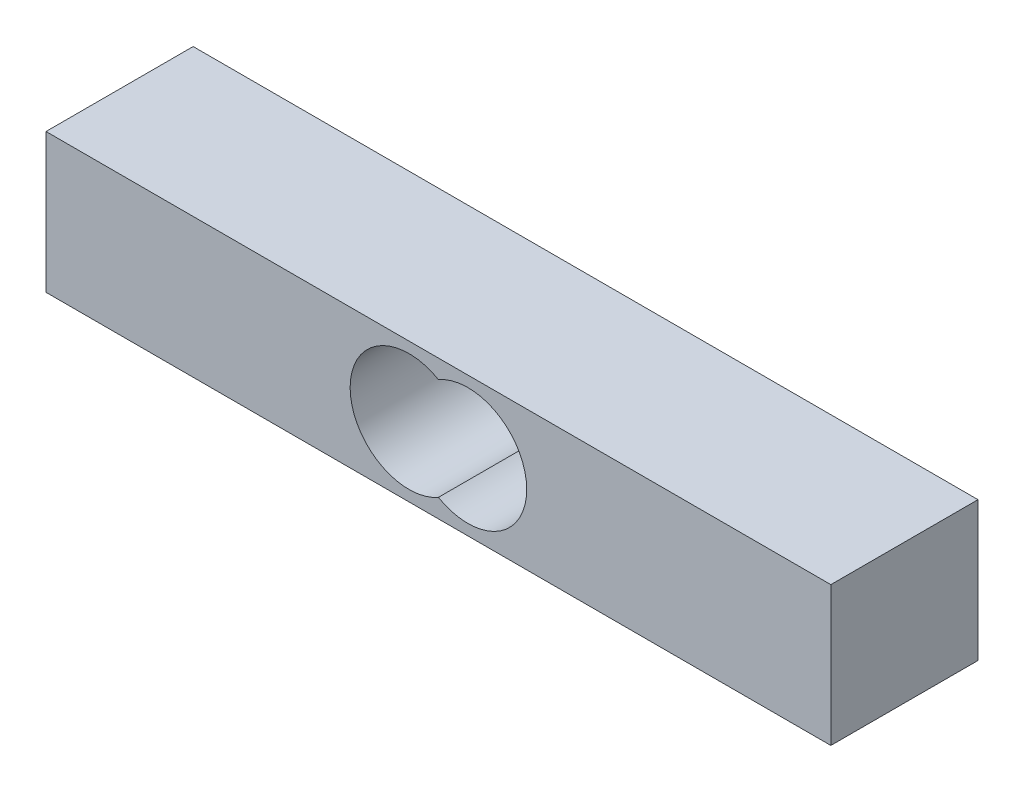
ISO-10303-21;
HEADER;
FILE_DESCRIPTION(('STEP AP214'),'2;1');
FILE_NAME('part.step','',(''),(''),'','','');
FILE_SCHEMA(('AUTOMOTIVE_DESIGN { 1 0 10303 214 1 1 1 1 }'));
ENDSEC;
DATA;
#1=APPLICATION_CONTEXT('core data for automotive mechanical design processes');
#2=APPLICATION_PROTOCOL_DEFINITION('international standard','automotive_design',2000,#1);
#3=PRODUCT_CONTEXT('',#1,'mechanical');
#4=PRODUCT('Part','Part','',(#3));
#5=PRODUCT_RELATED_PRODUCT_CATEGORY('part','',(#4));
#6=PRODUCT_DEFINITION_FORMATION('','',#4);
#7=PRODUCT_DEFINITION_CONTEXT('part definition',#1,'design');
#8=PRODUCT_DEFINITION('design','',#6,#7);
#9=PRODUCT_DEFINITION_SHAPE('','',#8);
#10=(LENGTH_UNIT() NAMED_UNIT(*) SI_UNIT(.MILLI.,.METRE.));
#11=(NAMED_UNIT(*) PLANE_ANGLE_UNIT() SI_UNIT($,.RADIAN.));
#12=(NAMED_UNIT(*) SI_UNIT($,.STERADIAN.) SOLID_ANGLE_UNIT());
#13=UNCERTAINTY_MEASURE_WITH_UNIT(LENGTH_MEASURE(1.E-05),#10,'distance_accuracy_value','');
#14=(GEOMETRIC_REPRESENTATION_CONTEXT(3) GLOBAL_UNCERTAINTY_ASSIGNED_CONTEXT((#13)) GLOBAL_UNIT_ASSIGNED_CONTEXT((#10,
#11,#12)) REPRESENTATION_CONTEXT('',''));
#15=CARTESIAN_POINT('',(0.,0.,0.));
#16=DIRECTION('',(0.,0.,1.));
#17=DIRECTION('',(1.,0.,0.));
#18=AXIS2_PLACEMENT_3D('',#15,#16,#17);
#19=CARTESIAN_POINT('',(40.,14.2,7.5));
#20=DIRECTION('',(-1.,0.,0.));
#21=DIRECTION('',(0.,0.,1.));
#22=AXIS2_PLACEMENT_3D('',#19,#20,#21);
#23=PLANE('',#22);
#24=DIRECTION('',(0.,0.,-1.));
#25=VECTOR('',#24,1.);
#26=CARTESIAN_POINT('',(40.,0.,7.5));
#27=LINE('',#26,#25);
#28=CARTESIAN_POINT('',(40.,0.,7.5));
#29=VERTEX_POINT('',#28);
#30=CARTESIAN_POINT('',(40.,0.,-7.5));
#31=VERTEX_POINT('',#30);
#32=EDGE_CURVE('E120',#29,#31,#27,.T.);
#33=ORIENTED_EDGE('',*,*,#32,.T.);
#34=DIRECTION('',(0.,-1.,0.));
#35=VECTOR('',#34,1.);
#36=CARTESIAN_POINT('',(40.,14.2,-7.5));
#37=LINE('',#36,#35);
#38=CARTESIAN_POINT('',(40.,14.2,-7.5));
#39=VERTEX_POINT('',#38);
#40=EDGE_CURVE('E11',#39,#31,#37,.T.);
#41=ORIENTED_EDGE('',*,*,#40,.F.);
#42=DIRECTION('',(0.,0.,-1.));
#43=VECTOR('',#42,1.);
#44=CARTESIAN_POINT('',(40.,14.2,7.5));
#45=LINE('',#44,#43);
#46=CARTESIAN_POINT('',(40.,14.2,7.5));
#47=VERTEX_POINT('',#46);
#48=EDGE_CURVE('E122',#47,#39,#45,.T.);
#49=ORIENTED_EDGE('',*,*,#48,.F.);
#50=DIRECTION('',(0.,-1.,0.));
#51=VECTOR('',#50,1.);
#52=CARTESIAN_POINT('',(40.,14.2,7.5));
#53=LINE('',#52,#51);
#54=EDGE_CURVE('E136',#47,#29,#53,.T.);
#55=ORIENTED_EDGE('',*,*,#54,.T.);
#56=EDGE_LOOP('',(#33,#41,#49,#55));
#57=FACE_BOUND('',#56,.T.);
#58=ADVANCED_FACE('F45',(#57),#23,.F.);
#59=CARTESIAN_POINT('',(-40.,14.2,-7.5));
#60=DIRECTION('',(0.,0.,1.));
#61=DIRECTION('',(1.,0.,0.));
#62=AXIS2_PLACEMENT_3D('',#59,#60,#61);
#63=PLANE('',#62);
#64=CARTESIAN_POINT('',(-3.,7.1,-7.5));
#65=DIRECTION('',(0.,0.,1.));
#66=DIRECTION('',(1.,0.,0.));
#67=AXIS2_PLACEMENT_3D('',#64,#65,#66);
#68=CIRCLE('',#67,6.);
#69=CARTESIAN_POINT('',(0.,12.2961524227066,-7.5));
#70=VERTEX_POINT('',#69);
#71=CARTESIAN_POINT('',(0.,1.90384757729337,-7.5));
#72=VERTEX_POINT('',#71);
#73=EDGE_CURVE('E102',#70,#72,#68,.T.);
#74=ORIENTED_EDGE('',*,*,#73,.T.);
#75=CARTESIAN_POINT('',(3.,7.1,-7.5));
#76=DIRECTION('',(0.,0.,1.));
#77=DIRECTION('',(1.,0.,0.));
#78=AXIS2_PLACEMENT_3D('',#75,#76,#77);
#79=CIRCLE('',#78,6.);
#80=EDGE_CURVE('E60',#72,#70,#79,.T.);
#81=ORIENTED_EDGE('',*,*,#80,.T.);
#82=EDGE_LOOP('',(#74,#81));
#83=FACE_BOUND('',#82,.T.);
#84=DIRECTION('',(-1.,0.,0.));
#85=VECTOR('',#84,1.);
#86=CARTESIAN_POINT('',(-40.,0.,-7.5));
#87=LINE('',#86,#85);
#88=CARTESIAN_POINT('',(-40.,0.,-7.5));
#89=VERTEX_POINT('',#88);
#90=EDGE_CURVE('E140',#31,#89,#87,.T.);
#91=ORIENTED_EDGE('',*,*,#90,.T.);
#92=DIRECTION('',(0.,-1.,0.));
#93=VECTOR('',#92,1.);
#94=CARTESIAN_POINT('',(-40.,14.2,-7.5));
#95=LINE('',#94,#93);
#96=CARTESIAN_POINT('',(-40.,14.2,-7.5));
#97=VERTEX_POINT('',#96);
#98=EDGE_CURVE('E53',#97,#89,#95,.T.);
#99=ORIENTED_EDGE('',*,*,#98,.F.);
#100=DIRECTION('',(-1.,0.,0.));
#101=VECTOR('',#100,1.);
#102=CARTESIAN_POINT('',(-40.,14.2,-7.5));
#103=LINE('',#102,#101);
#104=EDGE_CURVE('E126',#39,#97,#103,.T.);
#105=ORIENTED_EDGE('',*,*,#104,.F.);
#106=ORIENTED_EDGE('',*,*,#40,.T.);
#107=EDGE_LOOP('',(#91,#99,#105,#106));
#108=FACE_BOUND('',#107,.T.);
#109=ADVANCED_FACE('F109',(#83,#108),#63,.F.);
#110=CARTESIAN_POINT('',(-40.,14.2,7.5));
#111=DIRECTION('',(1.,0.,0.));
#112=DIRECTION('',(0.,0.,-1.));
#113=AXIS2_PLACEMENT_3D('',#110,#111,#112);
#114=PLANE('',#113);
#115=DIRECTION('',(0.,0.,1.));
#116=VECTOR('',#115,1.);
#117=CARTESIAN_POINT('',(-40.,0.,7.5));
#118=LINE('',#117,#116);
#119=CARTESIAN_POINT('',(-40.,0.,7.5));
#120=VERTEX_POINT('',#119);
#121=EDGE_CURVE('E143',#89,#120,#118,.T.);
#122=ORIENTED_EDGE('',*,*,#121,.T.);
#123=DIRECTION('',(0.,-1.,0.));
#124=VECTOR('',#123,1.);
#125=CARTESIAN_POINT('',(-40.,14.2,7.5));
#126=LINE('',#125,#124);
#127=CARTESIAN_POINT('',(-40.,14.2,7.5));
#128=VERTEX_POINT('',#127);
#129=EDGE_CURVE('E151',#128,#120,#126,.T.);
#130=ORIENTED_EDGE('',*,*,#129,.F.);
#131=DIRECTION('',(0.,0.,1.));
#132=VECTOR('',#131,1.);
#133=CARTESIAN_POINT('',(-40.,14.2,7.5));
#134=LINE('',#133,#132);
#135=EDGE_CURVE('E130',#97,#128,#134,.T.);
#136=ORIENTED_EDGE('',*,*,#135,.F.);
#137=ORIENTED_EDGE('',*,*,#98,.T.);
#138=EDGE_LOOP('',(#122,#130,#136,#137));
#139=FACE_BOUND('',#138,.T.);
#140=ADVANCED_FACE('F160',(#139),#114,.F.);
#141=CARTESIAN_POINT('',(-40.,14.2,7.5));
#142=DIRECTION('',(0.,0.,-1.));
#143=DIRECTION('',(-1.,0.,0.));
#144=AXIS2_PLACEMENT_3D('',#141,#142,#143);
#145=PLANE('',#144);
#146=CARTESIAN_POINT('',(-3.,7.1,7.5));
#147=DIRECTION('',(0.,0.,1.));
#148=DIRECTION('',(1.,0.,0.));
#149=AXIS2_PLACEMENT_3D('',#146,#147,#148);
#150=CIRCLE('',#149,6.);
#151=CARTESIAN_POINT('',(0.,12.2961524227066,7.5));
#152=VERTEX_POINT('',#151);
#153=CARTESIAN_POINT('',(0.,1.90384757729337,7.5));
#154=VERTEX_POINT('',#153);
#155=EDGE_CURVE('E112',#152,#154,#150,.T.);
#156=ORIENTED_EDGE('',*,*,#155,.F.);
#157=CARTESIAN_POINT('',(3.,7.1,7.5));
#158=DIRECTION('',(0.,0.,1.));
#159=DIRECTION('',(1.,0.,0.));
#160=AXIS2_PLACEMENT_3D('',#157,#158,#159);
#161=CIRCLE('',#160,6.);
#162=EDGE_CURVE('E65',#154,#152,#161,.T.);
#163=ORIENTED_EDGE('',*,*,#162,.F.);
#164=EDGE_LOOP('',(#156,#163));
#165=FACE_BOUND('',#164,.T.);
#166=DIRECTION('',(1.,0.,0.));
#167=VECTOR('',#166,1.);
#168=CARTESIAN_POINT('',(-40.,0.,7.5));
#169=LINE('',#168,#167);
#170=EDGE_CURVE('E127',#120,#29,#169,.T.);
#171=ORIENTED_EDGE('',*,*,#170,.T.);
#172=ORIENTED_EDGE('',*,*,#54,.F.);
#173=DIRECTION('',(1.,0.,0.));
#174=VECTOR('',#173,1.);
#175=CARTESIAN_POINT('',(-40.,14.2,7.5));
#176=LINE('',#175,#174);
#177=EDGE_CURVE('E133',#128,#47,#176,.T.);
#178=ORIENTED_EDGE('',*,*,#177,.F.);
#179=ORIENTED_EDGE('',*,*,#129,.T.);
#180=EDGE_LOOP('',(#171,#172,#178,#179));
#181=FACE_BOUND('',#180,.T.);
#182=ADVANCED_FACE('F168',(#165,#181),#145,.F.);
#183=CARTESIAN_POINT('',(0.,14.2,0.));
#184=DIRECTION('',(0.,-1.,0.));
#185=DIRECTION('',(0.,0.,-1.));
#186=AXIS2_PLACEMENT_3D('',#183,#184,#185);
#187=PLANE('',#186);
#188=ORIENTED_EDGE('',*,*,#48,.T.);
#189=ORIENTED_EDGE('',*,*,#104,.T.);
#190=ORIENTED_EDGE('',*,*,#135,.T.);
#191=ORIENTED_EDGE('',*,*,#177,.T.);
#192=EDGE_LOOP('',(#188,#189,#190,#191));
#193=FACE_BOUND('',#192,.T.);
#194=ADVANCED_FACE('F174',(#193),#187,.F.);
#195=CARTESIAN_POINT('',(0.,0.,0.));
#196=DIRECTION('',(0.,-1.,0.));
#197=DIRECTION('',(0.,0.,-1.));
#198=AXIS2_PLACEMENT_3D('',#195,#196,#197);
#199=PLANE('',#198);
#200=ORIENTED_EDGE('',*,*,#32,.F.);
#201=ORIENTED_EDGE('',*,*,#170,.F.);
#202=ORIENTED_EDGE('',*,*,#121,.F.);
#203=ORIENTED_EDGE('',*,*,#90,.F.);
#204=EDGE_LOOP('',(#200,#201,#202,#203));
#205=FACE_BOUND('',#204,.T.);
#206=ADVANCED_FACE('F165',(#205),#199,.T.);
#207=CARTESIAN_POINT('',(3.,7.1,-7.5));
#208=DIRECTION('',(0.,0.,1.));
#209=DIRECTION('',(1.,0.,0.));
#210=AXIS2_PLACEMENT_3D('',#207,#208,#209);
#211=CYLINDRICAL_SURFACE('',#210,6.);
#212=ORIENTED_EDGE('',*,*,#162,.T.);
#213=DIRECTION('',(0.,0.,1.));
#214=VECTOR('',#213,1.);
#215=CARTESIAN_POINT('',(0.,12.2961524227066,-7.5));
#216=LINE('',#215,#214);
#217=EDGE_CURVE('E94',#70,#152,#216,.T.);
#218=ORIENTED_EDGE('',*,*,#217,.F.);
#219=ORIENTED_EDGE('',*,*,#80,.F.);
#220=DIRECTION('',(0.,0.,1.));
#221=VECTOR('',#220,1.);
#222=CARTESIAN_POINT('',(0.,1.90384757729337,-7.5));
#223=LINE('',#222,#221);
#224=EDGE_CURVE('E101',#72,#154,#223,.T.);
#225=ORIENTED_EDGE('',*,*,#224,.T.);
#226=EDGE_LOOP('',(#212,#218,#219,#225));
#227=FACE_BOUND('',#226,.T.);
#228=ADVANCED_FACE('F96',(#227),#211,.F.);
#229=CARTESIAN_POINT('',(-3.,7.1,-7.5));
#230=DIRECTION('',(0.,0.,1.));
#231=DIRECTION('',(1.,0.,0.));
#232=AXIS2_PLACEMENT_3D('',#229,#230,#231);
#233=CYLINDRICAL_SURFACE('',#232,6.);
#234=ORIENTED_EDGE('',*,*,#155,.T.);
#235=ORIENTED_EDGE('',*,*,#224,.F.);
#236=ORIENTED_EDGE('',*,*,#73,.F.);
#237=ORIENTED_EDGE('',*,*,#217,.T.);
#238=EDGE_LOOP('',(#234,#235,#236,#237));
#239=FACE_BOUND('',#238,.T.);
#240=ADVANCED_FACE('F105',(#239),#233,.F.);
#241=CLOSED_SHELL('',(#58,#109,#140,#182,#194,#206,#228,#240));
#242=MANIFOLD_SOLID_BREP('B2',#241);
#243=ADVANCED_BREP_SHAPE_REPRESENTATION('',(#18,#242),#14);
#244=SHAPE_DEFINITION_REPRESENTATION(#9,#243);
ENDSEC;
END-ISO-10303-21;
